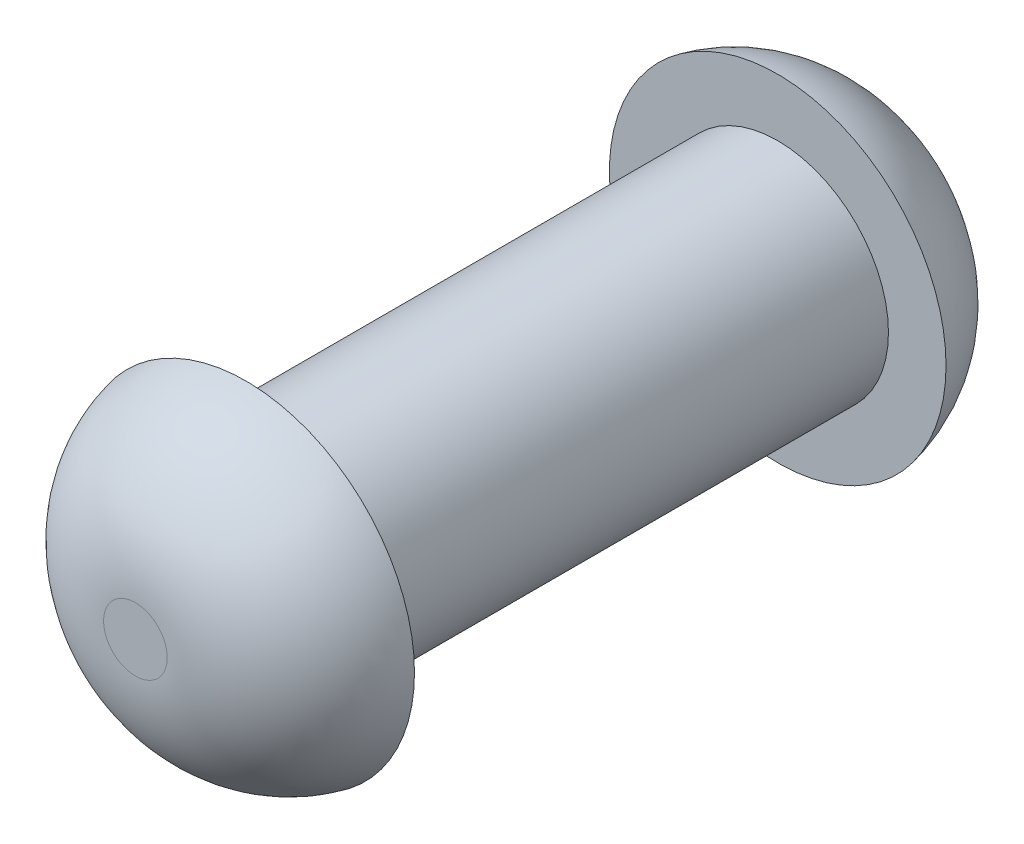
ISO-10303-21;
HEADER;
FILE_DESCRIPTION(('STEP AP214'),'2;1');
FILE_NAME('part.step','',(''),(''),'','','');
FILE_SCHEMA(('AUTOMOTIVE_DESIGN { 1 0 10303 214 1 1 1 1 }'));
ENDSEC;
DATA;
#1=APPLICATION_CONTEXT('core data for automotive mechanical design processes');
#2=APPLICATION_PROTOCOL_DEFINITION('international standard','automotive_design',2000,#1);
#3=PRODUCT_CONTEXT('',#1,'mechanical');
#4=PRODUCT('Part','Part','',(#3));
#5=PRODUCT_RELATED_PRODUCT_CATEGORY('part','',(#4));
#6=PRODUCT_DEFINITION_FORMATION('','',#4);
#7=PRODUCT_DEFINITION_CONTEXT('part definition',#1,'design');
#8=PRODUCT_DEFINITION('design','',#6,#7);
#9=PRODUCT_DEFINITION_SHAPE('','',#8);
#10=(LENGTH_UNIT() NAMED_UNIT(*) SI_UNIT(.MILLI.,.METRE.));
#11=(NAMED_UNIT(*) PLANE_ANGLE_UNIT() SI_UNIT($,.RADIAN.));
#12=(NAMED_UNIT(*) SI_UNIT($,.STERADIAN.) SOLID_ANGLE_UNIT());
#13=UNCERTAINTY_MEASURE_WITH_UNIT(LENGTH_MEASURE(1.E-05),#10,'distance_accuracy_value','');
#14=(GEOMETRIC_REPRESENTATION_CONTEXT(3) GLOBAL_UNCERTAINTY_ASSIGNED_CONTEXT((#13)) GLOBAL_UNIT_ASSIGNED_CONTEXT((#10,
#11,#12)) REPRESENTATION_CONTEXT('',''));
#15=CARTESIAN_POINT('',(0.,0.,0.));
#16=DIRECTION('',(0.,0.,1.));
#17=DIRECTION('',(1.,0.,0.));
#18=AXIS2_PLACEMENT_3D('',#15,#16,#17);
#19=CARTESIAN_POINT('',(0.,0.,3.81));
#20=DIRECTION('',(0.,0.,-1.));
#21=DIRECTION('',(-1.,0.,0.));
#22=AXIS2_PLACEMENT_3D('',#19,#20,#21);
#23=CYLINDRICAL_SURFACE('',#22,1.5875);
#24=CARTESIAN_POINT('',(0.,0.,3.81));
#25=DIRECTION('',(0.,0.,1.));
#26=DIRECTION('',(1.,0.,0.));
#27=AXIS2_PLACEMENT_3D('',#24,#25,#26);
#28=CIRCLE('',#27,1.5875);
#29=CARTESIAN_POINT('',(-1.5875,0.,3.81));
#30=VERTEX_POINT('',#29);
#31=EDGE_CURVE('E50',#30,#30,#28,.T.);
#32=CARTESIAN_POINT('',(0.,0.,-3.81));
#33=DIRECTION('',(0.,0.,-1.));
#34=DIRECTION('',(-1.,0.,0.));
#35=AXIS2_PLACEMENT_3D('',#32,#33,#34);
#36=CIRCLE('',#35,1.5875);
#37=CARTESIAN_POINT('',(-1.5875,0.,-3.81));
#38=VERTEX_POINT('',#37);
#39=EDGE_CURVE('E61',#38,#38,#36,.T.);
#40=CARTESIAN_POINT('',(-1.5875,0.,3.81));
#41=CARTESIAN_POINT('',(-1.5875,0.,3.730625));
#42=CARTESIAN_POINT('',(-1.5875,0.,3.65125));
#43=CARTESIAN_POINT('',(-1.5875,0.,3.4925));
#44=CARTESIAN_POINT('',(-1.5875,0.,3.413125));
#45=CARTESIAN_POINT('',(-1.5875,0.,3.254375));
#46=CARTESIAN_POINT('',(-1.5875,0.,3.175));
#47=CARTESIAN_POINT('',(-1.5875,0.,3.01625));
#48=CARTESIAN_POINT('',(-1.5875,0.,2.936875));
#49=CARTESIAN_POINT('',(-1.5875,0.,2.778125));
#50=CARTESIAN_POINT('',(-1.5875,0.,2.69875));
#51=CARTESIAN_POINT('',(-1.5875,0.,2.54));
#52=CARTESIAN_POINT('',(-1.5875,0.,2.460625));
#53=CARTESIAN_POINT('',(-1.5875,0.,2.301875));
#54=CARTESIAN_POINT('',(-1.5875,0.,2.2225));
#55=CARTESIAN_POINT('',(-1.5875,0.,2.06375));
#56=CARTESIAN_POINT('',(-1.5875,0.,1.984375));
#57=CARTESIAN_POINT('',(-1.5875,0.,1.825625));
#58=CARTESIAN_POINT('',(-1.5875,0.,1.74625));
#59=CARTESIAN_POINT('',(-1.5875,0.,1.5875));
#60=CARTESIAN_POINT('',(-1.5875,0.,1.508125));
#61=CARTESIAN_POINT('',(-1.5875,0.,1.349375));
#62=CARTESIAN_POINT('',(-1.5875,0.,1.27));
#63=CARTESIAN_POINT('',(-1.5875,0.,1.11125));
#64=CARTESIAN_POINT('',(-1.5875,0.,1.031875));
#65=CARTESIAN_POINT('',(-1.5875,0.,0.873125));
#66=CARTESIAN_POINT('',(-1.5875,0.,0.79375));
#67=CARTESIAN_POINT('',(-1.5875,0.,0.635));
#68=CARTESIAN_POINT('',(-1.5875,0.,0.555625));
#69=CARTESIAN_POINT('',(-1.5875,0.,0.396875));
#70=CARTESIAN_POINT('',(-1.5875,0.,0.3175));
#71=CARTESIAN_POINT('',(-1.5875,0.,0.15875));
#72=CARTESIAN_POINT('',(-1.5875,0.,0.079375));
#73=CARTESIAN_POINT('',(-1.5875,0.,-0.0793749999999997));
#74=CARTESIAN_POINT('',(-1.5875,0.,-0.158749999999999));
#75=CARTESIAN_POINT('',(-1.5875,0.,-0.317499999999999));
#76=CARTESIAN_POINT('',(-1.5875,0.,-0.396874999999999));
#77=CARTESIAN_POINT('',(-1.5875,0.,-0.555625));
#78=CARTESIAN_POINT('',(-1.5875,0.,-0.634999999999999));
#79=CARTESIAN_POINT('',(-1.5875,0.,-0.79375));
#80=CARTESIAN_POINT('',(-1.5875,0.,-0.873125));
#81=CARTESIAN_POINT('',(-1.5875,0.,-1.031875));
#82=CARTESIAN_POINT('',(-1.5875,0.,-1.11125));
#83=CARTESIAN_POINT('',(-1.5875,0.,-1.27));
#84=CARTESIAN_POINT('',(-1.5875,0.,-1.349375));
#85=CARTESIAN_POINT('',(-1.5875,0.,-1.508125));
#86=CARTESIAN_POINT('',(-1.5875,0.,-1.5875));
#87=CARTESIAN_POINT('',(-1.5875,0.,-1.74625));
#88=CARTESIAN_POINT('',(-1.5875,0.,-1.825625));
#89=CARTESIAN_POINT('',(-1.5875,0.,-1.984375));
#90=CARTESIAN_POINT('',(-1.5875,0.,-2.06375));
#91=CARTESIAN_POINT('',(-1.5875,0.,-2.2225));
#92=CARTESIAN_POINT('',(-1.5875,0.,-2.301875));
#93=CARTESIAN_POINT('',(-1.5875,0.,-2.460625));
#94=CARTESIAN_POINT('',(-1.5875,0.,-2.54));
#95=CARTESIAN_POINT('',(-1.5875,0.,-2.69875));
#96=CARTESIAN_POINT('',(-1.5875,0.,-2.778125));
#97=CARTESIAN_POINT('',(-1.5875,0.,-2.936875));
#98=CARTESIAN_POINT('',(-1.5875,0.,-3.01625));
#99=CARTESIAN_POINT('',(-1.5875,0.,-3.175));
#100=CARTESIAN_POINT('',(-1.5875,0.,-3.254375));
#101=CARTESIAN_POINT('',(-1.5875,0.,-3.413125));
#102=CARTESIAN_POINT('',(-1.5875,0.,-3.4925));
#103=CARTESIAN_POINT('',(-1.5875,0.,-3.65125));
#104=CARTESIAN_POINT('',(-1.5875,0.,-3.730625));
#105=CARTESIAN_POINT('',(-1.5875,0.,-3.81));
#106=B_SPLINE_CURVE_WITH_KNOTS('',3,(#40,#41,#42,#43,#44,#45,#46,#47,#48,#49,#50,#51,#52,#53,
#54,#55,#56,#57,#58,#59,#60,#61,#62,#63,#64,#65,#66,#67,#68,#69,#70,#71,#72,#73,#74,#75,#76,#77,
#78,#79,#80,#81,#82,#83,#84,#85,#86,#87,#88,#89,#90,#91,#92,#93,#94,#95,#96,#97,#98,#99,#100,
#101,#102,#103,#104,#105),.UNSPECIFIED.,.F.,.F.,(4,2,2,2,2,2,2,2,2,2,2,2,2,2,2,2,2,2,2,2,2,2,2,
2,2,2,2,2,2,2,2,2,4),(0.,0.238125,0.47625,0.714375,0.9525,1.190625,1.42875,1.666875,1.905,
2.143125,2.38125,2.619375,2.8575,3.095625,3.33375,3.571875,3.81,4.048125,4.28625,4.524375,
4.7625,5.000625,5.23875,5.476875,5.715,5.953125,6.19125,6.429375,6.6675,6.905625,7.14375,
7.381875,7.62),.UNSPECIFIED.);
#107=EDGE_CURVE('BSEAM37',#30,#38,#106,.T.);
#108=ORIENTED_EDGE('',*,*,#31,.F.);
#109=ORIENTED_EDGE('',*,*,#39,.F.);
#110=ORIENTED_EDGE('',*,*,#107,.T.);
#111=ORIENTED_EDGE('',*,*,#107,.F.);
#112=EDGE_LOOP('',(#108,#110,#109,#111));
#113=FACE_BOUND('',#112,.T.);
#114=ADVANCED_FACE('F37',(#113),#23,.T.);
#115=CARTESIAN_POINT('',(0.,0.,3.81));
#116=DIRECTION('',(0.,0.,1.));
#117=DIRECTION('',(1.,0.,0.));
#118=AXIS2_PLACEMENT_3D('',#115,#116,#117);
#119=PLANE('',#118);
#120=CARTESIAN_POINT('',(0.,0.,3.81));
#121=DIRECTION('',(0.,0.,1.));
#122=DIRECTION('',(1.,0.,0.));
#123=AXIS2_PLACEMENT_3D('',#120,#121,#122);
#124=CIRCLE('',#123,2.413);
#125=CARTESIAN_POINT('',(2.413,0.,3.81));
#126=VERTEX_POINT('',#125);
#127=EDGE_CURVE('E55',#126,#126,#124,.T.);
#128=ORIENTED_EDGE('',*,*,#127,.F.);
#129=EDGE_LOOP('',(#128));
#130=FACE_BOUND('',#129,.T.);
#131=ORIENTED_EDGE('',*,*,#31,.T.);
#132=EDGE_LOOP('',(#131));
#133=FACE_BOUND('',#132,.T.);
#134=ADVANCED_FACE('F81',(#130,#133),#119,.F.);
#135=CARTESIAN_POINT('',(0.,0.,5.3975));
#136=DIRECTION('',(0.,0.,1.));
#137=DIRECTION('',(1.,0.,0.));
#138=AXIS2_PLACEMENT_3D('',#135,#136,#137);
#139=PLANE('',#138);
#140=CARTESIAN_POINT('',(0.,0.,5.3975));
#141=DIRECTION('',(0.,0.,1.));
#142=DIRECTION('',(1.,0.,0.));
#143=AXIS2_PLACEMENT_3D('',#140,#141,#142);
#144=CIRCLE('',#143,0.456001341339243);
#145=CARTESIAN_POINT('',(0.456001341339243,0.,5.3975));
#146=VERTEX_POINT('',#145);
#147=EDGE_CURVE('E45',#146,#146,#144,.T.);
#148=ORIENTED_EDGE('',*,*,#147,.T.);
#149=EDGE_LOOP('',(#148));
#150=FACE_BOUND('',#149,.T.);
#151=ADVANCED_FACE('F87',(#150),#139,.T.);
#152=CARTESIAN_POINT('',(0.,0.,3.3975));
#153=DIRECTION('',(0.,0.,-1.));
#154=DIRECTION('',(-1.,0.,0.));
#155=AXIS2_PLACEMENT_3D('',#152,#153,#154);
#156=DEGENERATE_TOROIDAL_SURFACE('',#155,0.456001341339243,2.,.T.);
#157=ORIENTED_EDGE('',*,*,#127,.T.);
#158=EDGE_LOOP('',(#157));
#159=FACE_BOUND('',#158,.T.);
#160=ORIENTED_EDGE('',*,*,#147,.F.);
#161=EDGE_LOOP('',(#160));
#162=FACE_BOUND('',#161,.T.);
#163=ADVANCED_FACE('F93',(#159,#162),#156,.T.);
#164=CARTESIAN_POINT('',(0.,0.,-3.81));
#165=DIRECTION('',(0.,0.,-1.));
#166=DIRECTION('',(1.,0.,0.));
#167=AXIS2_PLACEMENT_3D('',#164,#165,#166);
#168=PLANE('',#167);
#169=CARTESIAN_POINT('',(0.,0.,-3.81));
#170=DIRECTION('',(0.,0.,1.));
#171=DIRECTION('',(1.,0.,0.));
#172=AXIS2_PLACEMENT_3D('',#169,#170,#171);
#173=CIRCLE('',#172,2.413);
#174=CARTESIAN_POINT('',(2.413,0.,-3.81));
#175=VERTEX_POINT('',#174);
#176=EDGE_CURVE('E65',#175,#175,#173,.T.);
#177=ORIENTED_EDGE('',*,*,#176,.T.);
#178=EDGE_LOOP('',(#177));
#179=FACE_BOUND('',#178,.T.);
#180=ORIENTED_EDGE('',*,*,#39,.T.);
#181=EDGE_LOOP('',(#180));
#182=FACE_BOUND('',#181,.T.);
#183=ADVANCED_FACE('F70',(#179,#182),#168,.F.);
#184=CARTESIAN_POINT('',(0.,0.,-5.3975));
#185=DIRECTION('',(0.,0.,-1.));
#186=DIRECTION('',(1.,0.,0.));
#187=AXIS2_PLACEMENT_3D('',#184,#185,#186);
#188=PLANE('',#187);
#189=CARTESIAN_POINT('',(0.,0.,-5.3975));
#190=DIRECTION('',(0.,0.,-1.));
#191=DIRECTION('',(-1.,0.,0.));
#192=AXIS2_PLACEMENT_3D('',#189,#190,#191);
#193=CIRCLE('',#192,0.456001341339243);
#194=CARTESIAN_POINT('',(-0.456001341339243,0.,-5.3975));
#195=VERTEX_POINT('',#194);
#196=EDGE_CURVE('E10',#195,#195,#193,.T.);
#197=ORIENTED_EDGE('',*,*,#196,.T.);
#198=EDGE_LOOP('',(#197));
#199=FACE_BOUND('',#198,.T.);
#200=ADVANCED_FACE('F74',(#199),#188,.T.);
#201=CARTESIAN_POINT('',(0.,0.,-3.3975));
#202=DIRECTION('',(0.,0.,1.));
#203=DIRECTION('',(1.,0.,0.));
#204=AXIS2_PLACEMENT_3D('',#201,#202,#203);
#205=DEGENERATE_TOROIDAL_SURFACE('',#204,0.456001341339243,2.,.T.);
#206=ORIENTED_EDGE('',*,*,#196,.F.);
#207=EDGE_LOOP('',(#206));
#208=FACE_BOUND('',#207,.T.);
#209=ORIENTED_EDGE('',*,*,#176,.F.);
#210=EDGE_LOOP('',(#209));
#211=FACE_BOUND('',#210,.T.);
#212=ADVANCED_FACE('F39',(#208,#211),#205,.T.);
#213=CLOSED_SHELL('',(#114,#134,#151,#163,#183,#200,#212));
#214=MANIFOLD_SOLID_BREP('B2',#213);
#215=ADVANCED_BREP_SHAPE_REPRESENTATION('',(#18,#214),#14);
#216=SHAPE_DEFINITION_REPRESENTATION(#9,#215);
ENDSEC;
END-ISO-10303-21;
